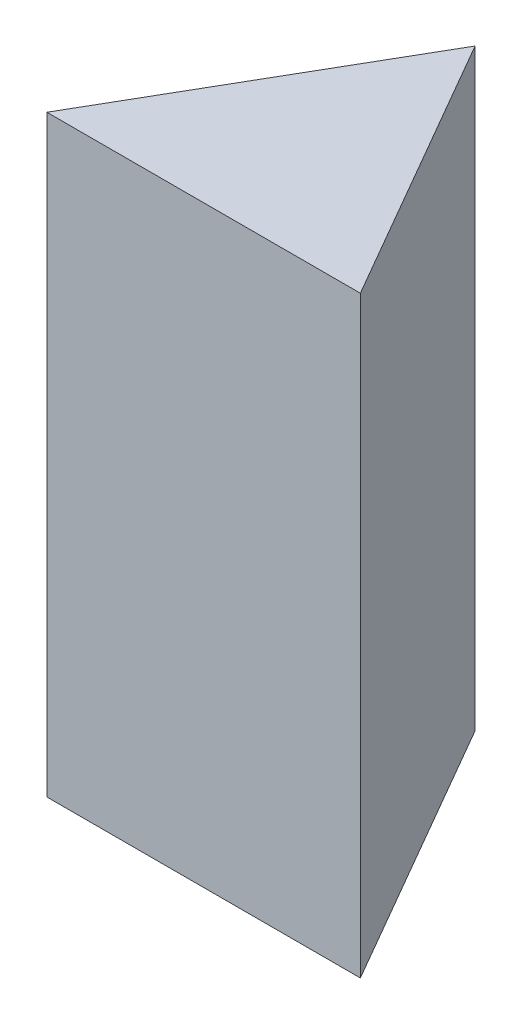
ISO-10303-21;
HEADER;
FILE_DESCRIPTION(('STEP AP214'),'2;1');
FILE_NAME('part.step','',(''),(''),'','','');
FILE_SCHEMA(('AUTOMOTIVE_DESIGN { 1 0 10303 214 1 1 1 1 }'));
ENDSEC;
DATA;
#1=APPLICATION_CONTEXT('core data for automotive mechanical design processes');
#2=APPLICATION_PROTOCOL_DEFINITION('international standard','automotive_design',2000,#1);
#3=PRODUCT_CONTEXT('',#1,'mechanical');
#4=PRODUCT('Part','Part','',(#3));
#5=PRODUCT_RELATED_PRODUCT_CATEGORY('part','',(#4));
#6=PRODUCT_DEFINITION_FORMATION('','',#4);
#7=PRODUCT_DEFINITION_CONTEXT('part definition',#1,'design');
#8=PRODUCT_DEFINITION('design','',#6,#7);
#9=PRODUCT_DEFINITION_SHAPE('','',#8);
#10=(LENGTH_UNIT() NAMED_UNIT(*) SI_UNIT(.MILLI.,.METRE.));
#11=(NAMED_UNIT(*) PLANE_ANGLE_UNIT() SI_UNIT($,.RADIAN.));
#12=(NAMED_UNIT(*) SI_UNIT($,.STERADIAN.) SOLID_ANGLE_UNIT());
#13=UNCERTAINTY_MEASURE_WITH_UNIT(LENGTH_MEASURE(1.E-05),#10,'distance_accuracy_value','');
#14=(GEOMETRIC_REPRESENTATION_CONTEXT(3) GLOBAL_UNCERTAINTY_ASSIGNED_CONTEXT((#13)) GLOBAL_UNIT_ASSIGNED_CONTEXT((#10,
#11,#12)) REPRESENTATION_CONTEXT('',''));
#15=CARTESIAN_POINT('',(0.,0.,0.));
#16=DIRECTION('',(0.,0.,1.));
#17=DIRECTION('',(1.,0.,0.));
#18=AXIS2_PLACEMENT_3D('',#15,#16,#17);
#19=CARTESIAN_POINT('',(40.6683434640574,-274.600895183663,13.8581939894495));
#20=DIRECTION('',(-0.866025403784439,0.,0.5));
#21=DIRECTION('',(0.5,0.,0.866025403784439));
#22=AXIS2_PLACEMENT_3D('',#19,#20,#21);
#23=PLANE('',#22);
#24=DIRECTION('',(-0.5,0.,-0.866025403784439));
#25=VECTOR('',#24,1.);
#26=CARTESIAN_POINT('',(40.6683434640574,-344.600895183663,13.8581939894495));
#27=LINE('',#26,#25);
#28=CARTESIAN_POINT('',(40.6683434640574,-344.600895183663,13.8581939894495));
#29=VERTEX_POINT('',#28);
#30=CARTESIAN_POINT('',(22.1683434640574,-344.600895183663,-18.1847459505747));
#31=VERTEX_POINT('',#30);
#32=EDGE_CURVE('E90',#29,#31,#27,.T.);
#33=ORIENTED_EDGE('',*,*,#32,.T.);
#34=DIRECTION('',(0.,-1.,0.));
#35=VECTOR('',#34,1.);
#36=CARTESIAN_POINT('',(22.1683434640574,-274.600895183663,-18.1847459505747));
#37=LINE('',#36,#35);
#38=CARTESIAN_POINT('',(22.1683434640574,-274.600895183663,-18.1847459505747));
#39=VERTEX_POINT('',#38);
#40=EDGE_CURVE('E11',#39,#31,#37,.T.);
#41=ORIENTED_EDGE('',*,*,#40,.F.);
#42=DIRECTION('',(-0.5,0.,-0.866025403784439));
#43=VECTOR('',#42,1.);
#44=CARTESIAN_POINT('',(40.6683434640574,-274.600895183663,13.8581939894495));
#45=LINE('',#44,#43);
#46=CARTESIAN_POINT('',(40.6683434640574,-274.600895183663,13.8581939894495));
#47=VERTEX_POINT('',#46);
#48=EDGE_CURVE('E83',#47,#39,#45,.T.);
#49=ORIENTED_EDGE('',*,*,#48,.F.);
#50=DIRECTION('',(0.,-1.,0.));
#51=VECTOR('',#50,1.);
#52=CARTESIAN_POINT('',(40.6683434640574,-274.600895183663,13.8581939894495));
#53=LINE('',#52,#51);
#54=EDGE_CURVE('E91',#47,#29,#53,.T.);
#55=ORIENTED_EDGE('',*,*,#54,.T.);
#56=EDGE_LOOP('',(#33,#41,#49,#55));
#57=FACE_BOUND('',#56,.T.);
#58=ADVANCED_FACE('F43',(#57),#23,.F.);
#59=CARTESIAN_POINT('',(22.1683434640574,-274.600895183663,-18.1847459505747));
#60=DIRECTION('',(0.866025403784439,0.,0.5));
#61=DIRECTION('',(0.5,0.,-0.866025403784439));
#62=AXIS2_PLACEMENT_3D('',#59,#60,#61);
#63=PLANE('',#62);
#64=DIRECTION('',(-0.5,0.,0.866025403784439));
#65=VECTOR('',#64,1.);
#66=CARTESIAN_POINT('',(22.1683434640574,-344.600895183663,-18.1847459505747));
#67=LINE('',#66,#65);
#68=CARTESIAN_POINT('',(3.6683434640574,-344.600895183663,13.8581939894495));
#69=VERTEX_POINT('',#68);
#70=EDGE_CURVE('E71',#31,#69,#67,.T.);
#71=ORIENTED_EDGE('',*,*,#70,.T.);
#72=DIRECTION('',(0.,-1.,0.));
#73=VECTOR('',#72,1.);
#74=CARTESIAN_POINT('',(3.6683434640574,-274.600895183663,13.8581939894495));
#75=LINE('',#74,#73);
#76=CARTESIAN_POINT('',(3.6683434640574,-274.600895183663,13.8581939894495));
#77=VERTEX_POINT('',#76);
#78=EDGE_CURVE('E51',#77,#69,#75,.T.);
#79=ORIENTED_EDGE('',*,*,#78,.F.);
#80=DIRECTION('',(-0.5,0.,0.866025403784439));
#81=VECTOR('',#80,1.);
#82=CARTESIAN_POINT('',(22.1683434640574,-274.600895183663,-18.1847459505747));
#83=LINE('',#82,#81);
#84=EDGE_CURVE('E79',#39,#77,#83,.T.);
#85=ORIENTED_EDGE('',*,*,#84,.F.);
#86=ORIENTED_EDGE('',*,*,#40,.T.);
#87=EDGE_LOOP('',(#71,#79,#85,#86));
#88=FACE_BOUND('',#87,.T.);
#89=ADVANCED_FACE('F80',(#88),#63,.F.);
#90=CARTESIAN_POINT('',(3.6683434640574,-274.600895183663,13.8581939894495));
#91=DIRECTION('',(0.,0.,-1.));
#92=DIRECTION('',(-1.,0.,0.));
#93=AXIS2_PLACEMENT_3D('',#90,#91,#92);
#94=PLANE('',#93);
#95=DIRECTION('',(1.,0.,0.));
#96=VECTOR('',#95,1.);
#97=CARTESIAN_POINT('',(3.6683434640574,-344.600895183663,13.8581939894495));
#98=LINE('',#97,#96);
#99=EDGE_CURVE('E76',#69,#29,#98,.T.);
#100=ORIENTED_EDGE('',*,*,#99,.T.);
#101=ORIENTED_EDGE('',*,*,#54,.F.);
#102=DIRECTION('',(1.,0.,0.));
#103=VECTOR('',#102,1.);
#104=CARTESIAN_POINT('',(3.6683434640574,-274.600895183663,13.8581939894495));
#105=LINE('',#104,#103);
#106=EDGE_CURVE('E59',#77,#47,#105,.T.);
#107=ORIENTED_EDGE('',*,*,#106,.F.);
#108=ORIENTED_EDGE('',*,*,#78,.T.);
#109=EDGE_LOOP('',(#100,#101,#107,#108));
#110=FACE_BOUND('',#109,.T.);
#111=ADVANCED_FACE('F98',(#110),#94,.F.);
#112=CARTESIAN_POINT('',(0.,-274.600895183663,0.));
#113=DIRECTION('',(0.,1.,0.));
#114=DIRECTION('',(0.,0.,1.));
#115=AXIS2_PLACEMENT_3D('',#112,#113,#114);
#116=PLANE('',#115);
#117=ORIENTED_EDGE('',*,*,#48,.T.);
#118=ORIENTED_EDGE('',*,*,#84,.T.);
#119=ORIENTED_EDGE('',*,*,#106,.T.);
#120=EDGE_LOOP('',(#117,#118,#119));
#121=FACE_BOUND('',#120,.T.);
#122=ADVANCED_FACE('F86',(#121),#116,.T.);
#123=CARTESIAN_POINT('',(0.,-344.600895183663,0.));
#124=DIRECTION('',(0.,1.,0.));
#125=DIRECTION('',(0.,0.,1.));
#126=AXIS2_PLACEMENT_3D('',#123,#124,#125);
#127=PLANE('',#126);
#128=ORIENTED_EDGE('',*,*,#32,.F.);
#129=ORIENTED_EDGE('',*,*,#99,.F.);
#130=ORIENTED_EDGE('',*,*,#70,.F.);
#131=EDGE_LOOP('',(#128,#129,#130));
#132=FACE_BOUND('',#131,.T.);
#133=ADVANCED_FACE('F99',(#132),#127,.F.);
#134=CLOSED_SHELL('',(#58,#89,#111,#122,#133));
#135=MANIFOLD_SOLID_BREP('B2',#134);
#136=ADVANCED_BREP_SHAPE_REPRESENTATION('',(#18,#135),#14);
#137=SHAPE_DEFINITION_REPRESENTATION(#9,#136);
ENDSEC;
END-ISO-10303-21;
